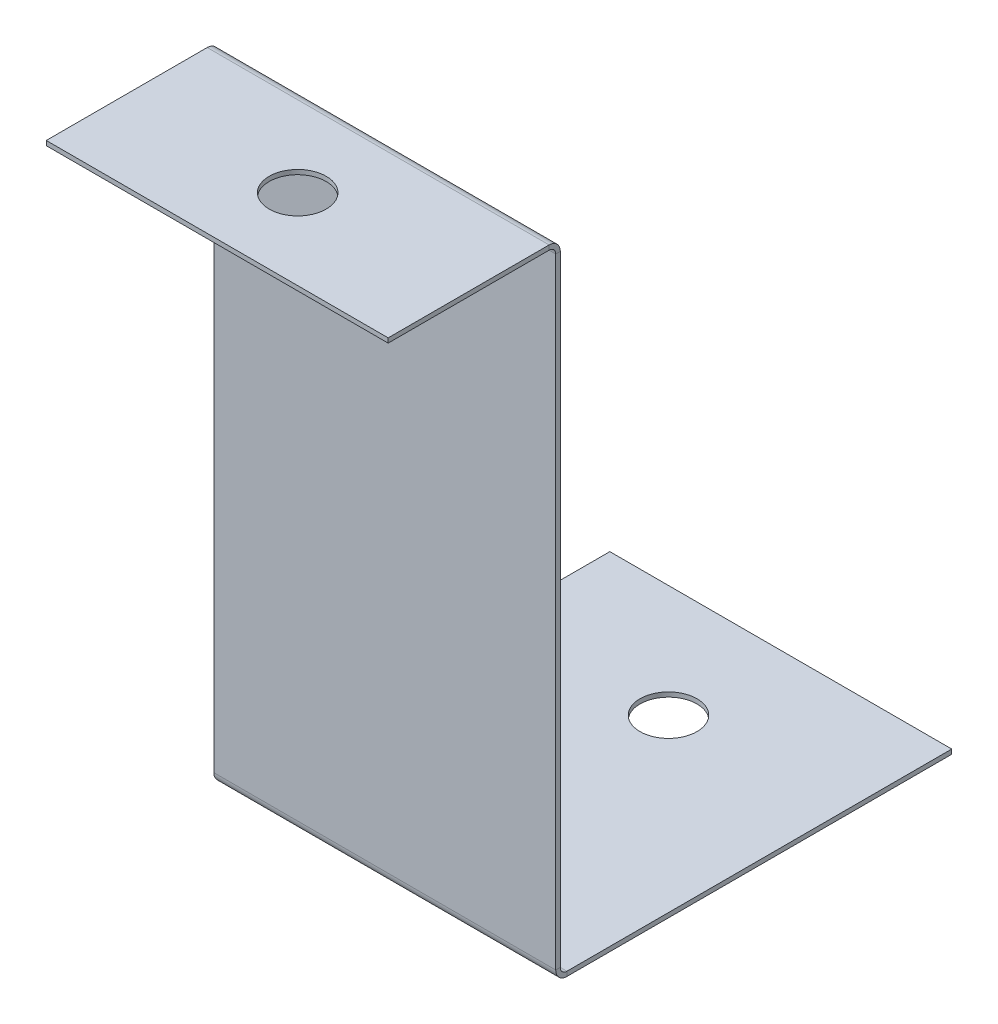
ISO-10303-21;
HEADER;
FILE_DESCRIPTION(('STEP AP214'),'2;1');
FILE_NAME('part.step','',(''),(''),'','','');
FILE_SCHEMA(('AUTOMOTIVE_DESIGN { 1 0 10303 214 1 1 1 1 }'));
ENDSEC;
DATA;
#1=APPLICATION_CONTEXT('core data for automotive mechanical design processes');
#2=APPLICATION_PROTOCOL_DEFINITION('international standard','automotive_design',2000,#1);
#3=PRODUCT_CONTEXT('',#1,'mechanical');
#4=PRODUCT('Part','Part','',(#3));
#5=PRODUCT_RELATED_PRODUCT_CATEGORY('part','',(#4));
#6=PRODUCT_DEFINITION_FORMATION('','',#4);
#7=PRODUCT_DEFINITION_CONTEXT('part definition',#1,'design');
#8=PRODUCT_DEFINITION('design','',#6,#7);
#9=PRODUCT_DEFINITION_SHAPE('','',#8);
#10=(LENGTH_UNIT() NAMED_UNIT(*) SI_UNIT(.MILLI.,.METRE.));
#11=(NAMED_UNIT(*) PLANE_ANGLE_UNIT() SI_UNIT($,.RADIAN.));
#12=(NAMED_UNIT(*) SI_UNIT($,.STERADIAN.) SOLID_ANGLE_UNIT());
#13=UNCERTAINTY_MEASURE_WITH_UNIT(LENGTH_MEASURE(1.E-05),#10,'distance_accuracy_value','');
#14=(GEOMETRIC_REPRESENTATION_CONTEXT(3) GLOBAL_UNCERTAINTY_ASSIGNED_CONTEXT((#13)) GLOBAL_UNIT_ASSIGNED_CONTEXT((#10,
#11,#12)) REPRESENTATION_CONTEXT('',''));
#15=CARTESIAN_POINT('',(0.,0.,0.));
#16=DIRECTION('',(0.,0.,1.));
#17=DIRECTION('',(1.,0.,0.));
#18=AXIS2_PLACEMENT_3D('',#15,#16,#17);
#19=CARTESIAN_POINT('',(-19.05,-5.58799999999952,132.930338317354));
#20=DIRECTION('',(0.,0.,1.));
#21=DIRECTION('',(0.,-1.,0.));
#22=AXIS2_PLACEMENT_3D('',#19,#20,#21);
#23=PLANE('',#22);
#24=DIRECTION('',(1.,0.,0.));
#25=VECTOR('',#24,1.);
#26=CARTESIAN_POINT('',(-19.05,-5.07999999999953,132.930338317354));
#27=LINE('',#26,#25);
#28=CARTESIAN_POINT('',(-19.05,-5.07999999999953,132.930338317354));
#29=VERTEX_POINT('',#28);
#30=CARTESIAN_POINT('',(19.05,-5.07999999999953,132.930338317354));
#31=VERTEX_POINT('',#30);
#32=EDGE_CURVE('E263',#29,#31,#27,.T.);
#33=ORIENTED_EDGE('',*,*,#32,.F.);
#34=DIRECTION('',(0.,1.,0.));
#35=VECTOR('',#34,1.);
#36=CARTESIAN_POINT('',(-19.05,-5.58799999999952,132.930338317354));
#37=LINE('',#36,#35);
#38=CARTESIAN_POINT('',(-19.05,-5.58799999999952,132.930338317354));
#39=VERTEX_POINT('',#38);
#40=EDGE_CURVE('E249',#39,#29,#37,.T.);
#41=ORIENTED_EDGE('',*,*,#40,.F.);
#42=DIRECTION('',(1.,0.,0.));
#43=VECTOR('',#42,1.);
#44=CARTESIAN_POINT('',(-19.05,-5.58799999999952,132.930338317354));
#45=LINE('',#44,#43);
#46=CARTESIAN_POINT('',(19.05,-5.58799999999952,132.930338317354));
#47=VERTEX_POINT('',#46);
#48=EDGE_CURVE('E284',#39,#47,#45,.T.);
#49=ORIENTED_EDGE('',*,*,#48,.T.);
#50=DIRECTION('',(0.,1.,0.));
#51=VECTOR('',#50,1.);
#52=CARTESIAN_POINT('',(19.05,-5.58799999999952,132.930338317354));
#53=LINE('',#52,#51);
#54=EDGE_CURVE('E281',#47,#31,#53,.T.);
#55=ORIENTED_EDGE('',*,*,#54,.T.);
#56=EDGE_LOOP('',(#33,#41,#49,#55));
#57=FACE_BOUND('',#56,.T.);
#58=ADVANCED_FACE('F77',(#57),#23,.T.);
#59=CARTESIAN_POINT('',(0.,5.58799999999961,123.962761448346));
#60=DIRECTION('',(0.,1.,0.));
#61=DIRECTION('',(0.,0.,1.));
#62=AXIS2_PLACEMENT_3D('',#59,#60,#61);
#63=CYLINDRICAL_SURFACE('',#62,3.17499999999999);
#64=CARTESIAN_POINT('',(0.,-5.58799999999955,123.962761448346));
#65=DIRECTION('',(0.,-1.,0.));
#66=DIRECTION('',(0.,0.,-1.));
#67=AXIS2_PLACEMENT_3D('',#64,#65,#66);
#68=CIRCLE('',#67,3.17499999999999);
#69=CARTESIAN_POINT('',(0.,-5.58799999999956,120.787761448346));
#70=VERTEX_POINT('',#69);
#71=EDGE_CURVE('E173',#70,#70,#68,.F.);
#72=ORIENTED_EDGE('',*,*,#71,.F.);
#73=EDGE_LOOP('',(#72));
#74=FACE_BOUND('',#73,.T.);
#75=CARTESIAN_POINT('',(0.,-5.07999999999956,123.962761448346));
#76=DIRECTION('',(0.,-1.,0.));
#77=DIRECTION('',(0.,0.,-1.));
#78=AXIS2_PLACEMENT_3D('',#75,#76,#77);
#79=CIRCLE('',#78,3.17499999999999);
#80=CARTESIAN_POINT('',(0.,-5.07999999999957,120.787761448346));
#81=VERTEX_POINT('',#80);
#82=EDGE_CURVE('E228',#81,#81,#79,.T.);
#83=ORIENTED_EDGE('',*,*,#82,.F.);
#84=EDGE_LOOP('',(#83));
#85=FACE_BOUND('',#84,.T.);
#86=ADVANCED_FACE('F407',(#74,#85),#63,.F.);
#87=CARTESIAN_POINT('',(0.,-5.5880000000005,-146.469661682647));
#88=DIRECTION('',(0.,-1.,0.));
#89=DIRECTION('',(-1.,0.,0.));
#90=AXIS2_PLACEMENT_3D('',#87,#88,#89);
#91=PLANE('',#90);
#92=DIRECTION('',(0.,0.,1.));
#93=VECTOR('',#92,1.);
#94=CARTESIAN_POINT('',(-19.05,-5.58799999999952,132.930338317354));
#95=LINE('',#94,#93);
#96=CARTESIAN_POINT('',(-19.05,-5.58799999999962,114.995184579338));
#97=VERTEX_POINT('',#96);
#98=EDGE_CURVE('E254',#97,#39,#95,.T.);
#99=ORIENTED_EDGE('',*,*,#98,.F.);
#100=DIRECTION('',(1.,0.,0.));
#101=VECTOR('',#100,1.);
#102=CARTESIAN_POINT('',(0.,-5.58799999999958,114.995184579338));
#103=LINE('',#102,#101);
#104=CARTESIAN_POINT('',(19.05,-5.58799999999959,114.995184579338));
#105=VERTEX_POINT('',#104);
#106=EDGE_CURVE('E278',#97,#105,#103,.T.);
#107=ORIENTED_EDGE('',*,*,#106,.T.);
#108=DIRECTION('',(0.,0.,-1.));
#109=VECTOR('',#108,1.);
#110=CARTESIAN_POINT('',(19.05,-5.58799999999952,132.930338317354));
#111=LINE('',#110,#109);
#112=EDGE_CURVE('E274',#47,#105,#111,.T.);
#113=ORIENTED_EDGE('',*,*,#112,.F.);
#114=ORIENTED_EDGE('',*,*,#48,.F.);
#115=EDGE_LOOP('',(#99,#107,#113,#114));
#116=FACE_BOUND('',#115,.T.);
#117=ORIENTED_EDGE('',*,*,#71,.T.);
#118=EDGE_LOOP('',(#117));
#119=FACE_BOUND('',#118,.T.);
#120=ADVANCED_FACE('F387',(#116,#119),#91,.T.);
#121=CARTESIAN_POINT('',(19.05,-5.58799999999952,132.930338317354));
#122=DIRECTION('',(1.,0.,0.));
#123=DIRECTION('',(0.,-1.,0.));
#124=AXIS2_PLACEMENT_3D('',#121,#122,#123);
#125=PLANE('',#124);
#126=ORIENTED_EDGE('',*,*,#112,.T.);
#127=DIRECTION('',(0.,1.,0.));
#128=VECTOR('',#127,1.);
#129=CARTESIAN_POINT('',(19.05,-5.58799999999947,114.995184579338));
#130=LINE('',#129,#128);
#131=CARTESIAN_POINT('',(19.05,-5.0799999999996,114.995184579338));
#132=VERTEX_POINT('',#131);
#133=EDGE_CURVE('E270',#105,#132,#130,.T.);
#134=ORIENTED_EDGE('',*,*,#133,.T.);
#135=DIRECTION('',(0.,0.,-1.));
#136=VECTOR('',#135,1.);
#137=CARTESIAN_POINT('',(19.05,-5.07999999999953,132.930338317354));
#138=LINE('',#137,#136);
#139=EDGE_CURVE('E260',#31,#132,#138,.T.);
#140=ORIENTED_EDGE('',*,*,#139,.F.);
#141=ORIENTED_EDGE('',*,*,#54,.F.);
#142=EDGE_LOOP('',(#126,#134,#140,#141));
#143=FACE_BOUND('',#142,.T.);
#144=ADVANCED_FACE('F391',(#143),#125,.T.);
#145=CARTESIAN_POINT('',(-19.05,-5.58799999999952,132.930338317354));
#146=DIRECTION('',(-1.,0.,0.));
#147=DIRECTION('',(0.,1.,0.));
#148=AXIS2_PLACEMENT_3D('',#145,#146,#147);
#149=PLANE('',#148);
#150=DIRECTION('',(0.,0.,1.));
#151=VECTOR('',#150,1.);
#152=CARTESIAN_POINT('',(-19.05,-5.07999999999953,132.930338317354));
#153=LINE('',#152,#151);
#154=CARTESIAN_POINT('',(-19.05,-5.0799999999996,114.995184579338));
#155=VERTEX_POINT('',#154);
#156=EDGE_CURVE('E267',#155,#29,#153,.T.);
#157=ORIENTED_EDGE('',*,*,#156,.F.);
#158=DIRECTION('',(0.,-1.,0.));
#159=VECTOR('',#158,1.);
#160=CARTESIAN_POINT('',(-19.05,-5.58799999999947,114.995184579338));
#161=LINE('',#160,#159);
#162=EDGE_CURVE('E257',#155,#97,#161,.T.);
#163=ORIENTED_EDGE('',*,*,#162,.T.);
#164=ORIENTED_EDGE('',*,*,#98,.T.);
#165=ORIENTED_EDGE('',*,*,#40,.T.);
#166=EDGE_LOOP('',(#157,#163,#164,#165));
#167=FACE_BOUND('',#166,.T.);
#168=ADVANCED_FACE('F402',(#167),#149,.T.);
#169=CARTESIAN_POINT('',(0.,-5.0800000000005,-146.469661682647));
#170=DIRECTION('',(0.,-1.,0.));
#171=DIRECTION('',(-1.,0.,0.));
#172=AXIS2_PLACEMENT_3D('',#169,#170,#171);
#173=PLANE('',#172);
#174=ORIENTED_EDGE('',*,*,#82,.T.);
#175=EDGE_LOOP('',(#174));
#176=FACE_BOUND('',#175,.T.);
#177=DIRECTION('',(1.,0.,0.));
#178=VECTOR('',#177,1.);
#179=CARTESIAN_POINT('',(0.,-5.07999999999958,114.995184579338));
#180=LINE('',#179,#178);
#181=EDGE_CURVE('E248',#155,#132,#180,.T.);
#182=ORIENTED_EDGE('',*,*,#181,.F.);
#183=ORIENTED_EDGE('',*,*,#156,.T.);
#184=ORIENTED_EDGE('',*,*,#32,.T.);
#185=ORIENTED_EDGE('',*,*,#139,.T.);
#186=EDGE_LOOP('',(#182,#183,#184,#185));
#187=FACE_BOUND('',#186,.T.);
#188=ADVANCED_FACE('F400',(#176,#187),#173,.F.);
#189=CARTESIAN_POINT('',(38.1351451548194,-6.32459999999962,114.995184579338));
#190=DIRECTION('',(-1.,0.,0.));
#191=DIRECTION('',(0.,-1.,0.));
#192=AXIS2_PLACEMENT_3D('',#189,#190,#191);
#193=CYLINDRICAL_SURFACE('',#192,0.7366);
#194=DIRECTION('',(1.,0.,0.));
#195=VECTOR('',#194,1.);
#196=CARTESIAN_POINT('',(0.,-6.32459999999963,114.258584579338));
#197=LINE('',#196,#195);
#198=CARTESIAN_POINT('',(-19.05,-6.32459999999961,114.258584579338));
#199=VERTEX_POINT('',#198);
#200=CARTESIAN_POINT('',(19.05,-6.32459999999961,114.258584579338));
#201=VERTEX_POINT('',#200);
#202=EDGE_CURVE('E200',#199,#201,#197,.T.);
#203=ORIENTED_EDGE('',*,*,#202,.T.);
#204=CARTESIAN_POINT('',(19.05,-6.32459999999962,114.995184579338));
#205=DIRECTION('',(1.,0.,0.));
#206=DIRECTION('',(0.,0.,1.));
#207=AXIS2_PLACEMENT_3D('',#204,#205,#206);
#208=CIRCLE('',#207,0.736600000000002);
#209=EDGE_CURVE('E295',#201,#105,#208,.T.);
#210=ORIENTED_EDGE('',*,*,#209,.T.);
#211=ORIENTED_EDGE('',*,*,#106,.F.);
#212=CARTESIAN_POINT('',(-19.05,-6.32459999999962,114.995184579338));
#213=DIRECTION('',(-1.,0.,0.));
#214=DIRECTION('',(0.,0.,-1.));
#215=AXIS2_PLACEMENT_3D('',#212,#213,#214);
#216=CIRCLE('',#215,0.736600000000002);
#217=EDGE_CURVE('E291',#97,#199,#216,.T.);
#218=ORIENTED_EDGE('',*,*,#217,.T.);
#219=EDGE_LOOP('',(#203,#210,#211,#218));
#220=FACE_BOUND('',#219,.T.);
#221=ADVANCED_FACE('F383',(#220),#193,.F.);
#222=CARTESIAN_POINT('',(19.05,-6.32459999999962,114.995184579338));
#223=DIRECTION('',(-1.,0.,0.));
#224=DIRECTION('',(0.,0.,1.));
#225=AXIS2_PLACEMENT_3D('',#222,#223,#224);
#226=PLANE('',#225);
#227=CARTESIAN_POINT('',(19.05,-6.32459999999962,114.995184579338));
#228=DIRECTION('',(-1.,0.,0.));
#229=DIRECTION('',(0.,-1.,0.));
#230=AXIS2_PLACEMENT_3D('',#227,#228,#229);
#231=CIRCLE('',#230,1.2446);
#232=CARTESIAN_POINT('',(19.05,-6.32459999999963,113.750584579338));
#233=VERTEX_POINT('',#232);
#234=EDGE_CURVE('E296',#233,#132,#231,.F.);
#235=ORIENTED_EDGE('',*,*,#234,.T.);
#236=ORIENTED_EDGE('',*,*,#133,.F.);
#237=ORIENTED_EDGE('',*,*,#209,.F.);
#238=DIRECTION('',(0.,0.,-1.));
#239=VECTOR('',#238,1.);
#240=CARTESIAN_POINT('',(19.05,-6.32459999999961,114.258584579338));
#241=LINE('',#240,#239);
#242=EDGE_CURVE('E204',#201,#233,#241,.T.);
#243=ORIENTED_EDGE('',*,*,#242,.T.);
#244=EDGE_LOOP('',(#235,#236,#237,#243));
#245=FACE_BOUND('',#244,.T.);
#246=ADVANCED_FACE('F394',(#245),#226,.F.);
#247=CARTESIAN_POINT('',(-19.05,-6.32459999999962,114.995184579338));
#248=DIRECTION('',(1.,0.,0.));
#249=DIRECTION('',(0.,0.,-1.));
#250=AXIS2_PLACEMENT_3D('',#247,#248,#249);
#251=PLANE('',#250);
#252=ORIENTED_EDGE('',*,*,#162,.F.);
#253=CARTESIAN_POINT('',(-19.05,-6.32459999999962,114.995184579338));
#254=DIRECTION('',(-1.,0.,0.));
#255=DIRECTION('',(0.,-1.,0.));
#256=AXIS2_PLACEMENT_3D('',#253,#254,#255);
#257=CIRCLE('',#256,1.2446);
#258=CARTESIAN_POINT('',(-19.05,-6.32459999999961,113.750584579338));
#259=VERTEX_POINT('',#258);
#260=EDGE_CURVE('E253',#155,#259,#257,.T.);
#261=ORIENTED_EDGE('',*,*,#260,.T.);
#262=DIRECTION('',(0.,0.,1.));
#263=VECTOR('',#262,1.);
#264=CARTESIAN_POINT('',(-19.05,-6.32459999999961,114.258584579338));
#265=LINE('',#264,#263);
#266=EDGE_CURVE('E86',#259,#199,#265,.T.);
#267=ORIENTED_EDGE('',*,*,#266,.T.);
#268=ORIENTED_EDGE('',*,*,#217,.F.);
#269=EDGE_LOOP('',(#252,#261,#267,#268));
#270=FACE_BOUND('',#269,.T.);
#271=ADVANCED_FACE('F379',(#270),#251,.F.);
#272=CARTESIAN_POINT('',(38.1351451548194,-6.32459999999962,114.995184579338));
#273=DIRECTION('',(-1.,0.,0.));
#274=DIRECTION('',(0.,-1.,0.));
#275=AXIS2_PLACEMENT_3D('',#272,#273,#274);
#276=CYLINDRICAL_SURFACE('',#275,1.2446);
#277=DIRECTION('',(1.,0.,0.));
#278=VECTOR('',#277,1.);
#279=CARTESIAN_POINT('',(0.,-6.32459999999963,113.750584579338));
#280=LINE('',#279,#278);
#281=EDGE_CURVE('E209',#259,#233,#280,.T.);
#282=ORIENTED_EDGE('',*,*,#281,.F.);
#283=ORIENTED_EDGE('',*,*,#260,.F.);
#284=ORIENTED_EDGE('',*,*,#181,.T.);
#285=ORIENTED_EDGE('',*,*,#234,.F.);
#286=EDGE_LOOP('',(#282,#283,#284,#285));
#287=FACE_BOUND('',#286,.T.);
#288=ADVANCED_FACE('F397',(#287),#276,.T.);
#289=CARTESIAN_POINT('',(0.,-266.233415420661,114.25858457934));
#290=DIRECTION('',(0.,0.,1.));
#291=DIRECTION('',(-1.,0.,0.));
#292=AXIS2_PLACEMENT_3D('',#289,#290,#291);
#293=PLANE('',#292);
#294=ORIENTED_EDGE('',*,*,#202,.F.);
#295=DIRECTION('',(0.,1.,0.));
#296=VECTOR('',#295,1.);
#297=CARTESIAN_POINT('',(-19.05,13.1665845793389,114.258584579338));
#298=LINE('',#297,#296);
#299=CARTESIAN_POINT('',(-19.05,-75.4219845793381,114.258584579339));
#300=VERTEX_POINT('',#299);
#301=EDGE_CURVE('E215',#300,#199,#298,.T.);
#302=ORIENTED_EDGE('',*,*,#301,.F.);
#303=DIRECTION('',(-1.,0.,0.));
#304=VECTOR('',#303,1.);
#305=CARTESIAN_POINT('',(0.,-75.4219845793381,114.258584579338));
#306=LINE('',#305,#304);
#307=CARTESIAN_POINT('',(19.05,-75.4219845793381,114.258584579338));
#308=VERTEX_POINT('',#307);
#309=EDGE_CURVE('E300',#308,#300,#306,.T.);
#310=ORIENTED_EDGE('',*,*,#309,.F.);
#311=DIRECTION('',(0.,-1.,0.));
#312=VECTOR('',#311,1.);
#313=CARTESIAN_POINT('',(19.05,13.1665845793389,114.258584579338));
#314=LINE('',#313,#312);
#315=EDGE_CURVE('E223',#201,#308,#314,.T.);
#316=ORIENTED_EDGE('',*,*,#315,.F.);
#317=EDGE_LOOP('',(#294,#302,#310,#316));
#318=FACE_BOUND('',#317,.T.);
#319=ADVANCED_FACE('F372',(#318),#293,.T.);
#320=CARTESIAN_POINT('',(19.05,13.1665845793389,114.258584579338));
#321=DIRECTION('',(1.,0.,0.));
#322=DIRECTION('',(0.,0.,1.));
#323=AXIS2_PLACEMENT_3D('',#320,#321,#322);
#324=PLANE('',#323);
#325=ORIENTED_EDGE('',*,*,#242,.F.);
#326=ORIENTED_EDGE('',*,*,#315,.T.);
#327=DIRECTION('',(0.,0.,1.));
#328=VECTOR('',#327,1.);
#329=CARTESIAN_POINT('',(19.05,-75.4219845793381,114.258584579338));
#330=LINE('',#329,#328);
#331=CARTESIAN_POINT('',(19.05,-75.4219845793381,113.750584579338));
#332=VERTEX_POINT('',#331);
#333=EDGE_CURVE('E227',#332,#308,#330,.T.);
#334=ORIENTED_EDGE('',*,*,#333,.F.);
#335=DIRECTION('',(0.,-1.,0.));
#336=VECTOR('',#335,1.);
#337=CARTESIAN_POINT('',(19.05,13.1665845793389,113.750584579338));
#338=LINE('',#337,#336);
#339=EDGE_CURVE('E219',#233,#332,#338,.T.);
#340=ORIENTED_EDGE('',*,*,#339,.F.);
#341=EDGE_LOOP('',(#325,#326,#334,#340));
#342=FACE_BOUND('',#341,.T.);
#343=ADVANCED_FACE('F452',(#342),#324,.T.);
#344=CARTESIAN_POINT('',(-19.05,13.1665845793389,114.258584579338));
#345=DIRECTION('',(-1.,0.,0.));
#346=DIRECTION('',(0.,0.,-1.));
#347=AXIS2_PLACEMENT_3D('',#344,#345,#346);
#348=PLANE('',#347);
#349=ORIENTED_EDGE('',*,*,#266,.F.);
#350=DIRECTION('',(0.,1.,0.));
#351=VECTOR('',#350,1.);
#352=CARTESIAN_POINT('',(-19.05,13.1665845793389,113.750584579338));
#353=LINE('',#352,#351);
#354=CARTESIAN_POINT('',(-19.05,-75.4219845793381,113.750584579338));
#355=VERTEX_POINT('',#354);
#356=EDGE_CURVE('E100',#355,#259,#353,.T.);
#357=ORIENTED_EDGE('',*,*,#356,.F.);
#358=DIRECTION('',(0.,0.,-1.));
#359=VECTOR('',#358,1.);
#360=CARTESIAN_POINT('',(-19.05,-75.4219845793381,114.258584579338));
#361=LINE('',#360,#359);
#362=EDGE_CURVE('E312',#300,#355,#361,.T.);
#363=ORIENTED_EDGE('',*,*,#362,.F.);
#364=ORIENTED_EDGE('',*,*,#301,.T.);
#365=EDGE_LOOP('',(#349,#357,#363,#364));
#366=FACE_BOUND('',#365,.T.);
#367=ADVANCED_FACE('F79',(#366),#348,.T.);
#368=CARTESIAN_POINT('',(0.,-266.233415420661,113.75058457934));
#369=DIRECTION('',(0.,0.,1.));
#370=DIRECTION('',(-1.,0.,0.));
#371=AXIS2_PLACEMENT_3D('',#368,#369,#370);
#372=PLANE('',#371);
#373=ORIENTED_EDGE('',*,*,#356,.T.);
#374=ORIENTED_EDGE('',*,*,#281,.T.);
#375=ORIENTED_EDGE('',*,*,#339,.T.);
#376=DIRECTION('',(-1.,0.,0.));
#377=VECTOR('',#376,1.);
#378=CARTESIAN_POINT('',(0.,-75.4219845793381,113.750584579338));
#379=LINE('',#378,#377);
#380=EDGE_CURVE('E222',#332,#355,#379,.T.);
#381=ORIENTED_EDGE('',*,*,#380,.T.);
#382=EDGE_LOOP('',(#373,#374,#375,#381));
#383=FACE_BOUND('',#382,.T.);
#384=ADVANCED_FACE('F366',(#383),#372,.F.);
#385=CARTESIAN_POINT('',(38.1351451548194,-75.4219845793381,113.013984579339));
#386=DIRECTION('',(-1.,0.,0.));
#387=DIRECTION('',(0.,0.,1.));
#388=AXIS2_PLACEMENT_3D('',#385,#386,#387);
#389=CYLINDRICAL_SURFACE('',#388,1.2446);
#390=ORIENTED_EDGE('',*,*,#309,.T.);
#391=CARTESIAN_POINT('',(-19.05,-75.4219845793381,113.013984579339));
#392=DIRECTION('',(1.,0.,0.));
#393=DIRECTION('',(0.,0.,1.));
#394=AXIS2_PLACEMENT_3D('',#391,#392,#393);
#395=CIRCLE('',#394,1.2446);
#396=CARTESIAN_POINT('',(-19.05,-76.6665845793381,113.013984579339));
#397=VERTEX_POINT('',#396);
#398=EDGE_CURVE('E196',#300,#397,#395,.T.);
#399=ORIENTED_EDGE('',*,*,#398,.T.);
#400=DIRECTION('',(-1.,0.,0.));
#401=VECTOR('',#400,1.);
#402=CARTESIAN_POINT('',(0.,-76.6665845793381,113.013984579339));
#403=LINE('',#402,#401);
#404=CARTESIAN_POINT('',(19.05,-76.6665845793381,113.013984579339));
#405=VERTEX_POINT('',#404);
#406=EDGE_CURVE('E333',#405,#397,#403,.T.);
#407=ORIENTED_EDGE('',*,*,#406,.F.);
#408=CARTESIAN_POINT('',(19.05,-75.4219845793381,113.013984579339));
#409=DIRECTION('',(-1.,0.,0.));
#410=DIRECTION('',(0.,0.,-1.));
#411=AXIS2_PLACEMENT_3D('',#408,#409,#410);
#412=CIRCLE('',#411,1.2446);
#413=EDGE_CURVE('E319',#405,#308,#412,.T.);
#414=ORIENTED_EDGE('',*,*,#413,.T.);
#415=EDGE_LOOP('',(#390,#399,#407,#414));
#416=FACE_BOUND('',#415,.T.);
#417=ADVANCED_FACE('F355',(#416),#389,.T.);
#418=CARTESIAN_POINT('',(19.05,-75.4219845793381,113.013984579339));
#419=DIRECTION('',(1.,0.,0.));
#420=DIRECTION('',(0.,0.,-1.));
#421=AXIS2_PLACEMENT_3D('',#418,#419,#420);
#422=PLANE('',#421);
#423=DIRECTION('',(0.,-1.,0.));
#424=VECTOR('',#423,1.);
#425=CARTESIAN_POINT('',(19.05,-76.6665845793381,113.013984579338));
#426=LINE('',#425,#424);
#427=CARTESIAN_POINT('',(19.05,-76.1585845793381,113.013984579339));
#428=VERTEX_POINT('',#427);
#429=EDGE_CURVE('E337',#428,#405,#426,.T.);
#430=ORIENTED_EDGE('',*,*,#429,.F.);
#431=CARTESIAN_POINT('',(19.05,-75.4219845793381,113.013984579339));
#432=DIRECTION('',(-1.,0.,0.));
#433=DIRECTION('',(0.,0.,1.));
#434=AXIS2_PLACEMENT_3D('',#431,#432,#433);
#435=CIRCLE('',#434,0.7366);
#436=EDGE_CURVE('E218',#428,#332,#435,.T.);
#437=ORIENTED_EDGE('',*,*,#436,.T.);
#438=ORIENTED_EDGE('',*,*,#333,.T.);
#439=ORIENTED_EDGE('',*,*,#413,.F.);
#440=EDGE_LOOP('',(#430,#437,#438,#439));
#441=FACE_BOUND('',#440,.T.);
#442=ADVANCED_FACE('F362',(#441),#422,.T.);
#443=CARTESIAN_POINT('',(-19.05,-75.4219845793381,113.013984579339));
#444=DIRECTION('',(-1.,0.,0.));
#445=DIRECTION('',(0.,0.,1.));
#446=AXIS2_PLACEMENT_3D('',#443,#444,#445);
#447=PLANE('',#446);
#448=CARTESIAN_POINT('',(-19.05,-75.4219845793381,113.013984579339));
#449=DIRECTION('',(-1.,0.,0.));
#450=DIRECTION('',(0.,0.,1.));
#451=AXIS2_PLACEMENT_3D('',#448,#449,#450);
#452=CIRCLE('',#451,0.7366);
#453=CARTESIAN_POINT('',(-19.05,-76.1585845793381,113.013984579339));
#454=VERTEX_POINT('',#453);
#455=EDGE_CURVE('E323',#355,#454,#452,.F.);
#456=ORIENTED_EDGE('',*,*,#455,.T.);
#457=DIRECTION('',(0.,1.,0.));
#458=VECTOR('',#457,1.);
#459=CARTESIAN_POINT('',(-19.05,-76.6665845793381,113.013984579338));
#460=LINE('',#459,#458);
#461=EDGE_CURVE('E205',#397,#454,#460,.T.);
#462=ORIENTED_EDGE('',*,*,#461,.F.);
#463=ORIENTED_EDGE('',*,*,#398,.F.);
#464=ORIENTED_EDGE('',*,*,#362,.T.);
#465=EDGE_LOOP('',(#456,#462,#463,#464));
#466=FACE_BOUND('',#465,.T.);
#467=ADVANCED_FACE('F352',(#466),#447,.T.);
#468=CARTESIAN_POINT('',(38.1351451548194,-75.4219845793381,113.013984579339));
#469=DIRECTION('',(-1.,0.,0.));
#470=DIRECTION('',(0.,0.,1.));
#471=AXIS2_PLACEMENT_3D('',#468,#469,#470);
#472=CYLINDRICAL_SURFACE('',#471,0.7366);
#473=ORIENTED_EDGE('',*,*,#380,.F.);
#474=ORIENTED_EDGE('',*,*,#436,.F.);
#475=DIRECTION('',(-1.,0.,0.));
#476=VECTOR('',#475,1.);
#477=CARTESIAN_POINT('',(0.,-76.1585845793381,113.013984579339));
#478=LINE('',#477,#476);
#479=EDGE_CURVE('E188',#428,#454,#478,.T.);
#480=ORIENTED_EDGE('',*,*,#479,.T.);
#481=ORIENTED_EDGE('',*,*,#455,.F.);
#482=EDGE_LOOP('',(#473,#474,#480,#481));
#483=FACE_BOUND('',#482,.T.);
#484=ADVANCED_FACE('F365',(#483),#472,.F.);
#485=CARTESIAN_POINT('',(0.,76.6665845793382,82.6435922896691));
#486=DIRECTION('',(0.,1.,0.));
#487=DIRECTION('',(0.,0.,1.));
#488=AXIS2_PLACEMENT_3D('',#485,#486,#487);
#489=CYLINDRICAL_SURFACE('',#488,3.17499999999997);
#490=CARTESIAN_POINT('',(0.,-76.6665845793388,82.6435922896686));
#491=DIRECTION('',(0.,1.,0.));
#492=DIRECTION('',(0.,0.,1.));
#493=AXIS2_PLACEMENT_3D('',#490,#491,#492);
#494=CIRCLE('',#493,3.17499999999996);
#495=CARTESIAN_POINT('',(0.,-76.6665845793388,85.8185922896685));
#496=VERTEX_POINT('',#495);
#497=EDGE_CURVE('E231',#496,#496,#494,.T.);
#498=ORIENTED_EDGE('',*,*,#497,.F.);
#499=EDGE_LOOP('',(#498));
#500=FACE_BOUND('',#499,.T.);
#501=CARTESIAN_POINT('',(0.,-76.1585845793382,82.6435922896686));
#502=DIRECTION('',(0.,-1.,0.));
#503=DIRECTION('',(0.,0.,-1.));
#504=AXIS2_PLACEMENT_3D('',#501,#502,#503);
#505=CIRCLE('',#504,3.17499999999997);
#506=CARTESIAN_POINT('',(0.,-76.1585845793382,79.4685922896686));
#507=VERTEX_POINT('',#506);
#508=EDGE_CURVE('E237',#507,#507,#505,.T.);
#509=ORIENTED_EDGE('',*,*,#508,.F.);
#510=EDGE_LOOP('',(#509));
#511=FACE_BOUND('',#510,.T.);
#512=ADVANCED_FACE('F416',(#500,#511),#489,.F.);
#513=CARTESIAN_POINT('',(0.,-76.1585845793388,-76.2414154206615));
#514=DIRECTION('',(0.,-1.,0.));
#515=DIRECTION('',(-1.,0.,0.));
#516=AXIS2_PLACEMENT_3D('',#513,#514,#515);
#517=PLANE('',#516);
#518=ORIENTED_EDGE('',*,*,#508,.T.);
#519=EDGE_LOOP('',(#518));
#520=FACE_BOUND('',#519,.T.);
#521=DIRECTION('',(0.,0.,-1.));
#522=VECTOR('',#521,1.);
#523=CARTESIAN_POINT('',(19.05,-76.1585845793378,203.158584579339));
#524=LINE('',#523,#522);
#525=CARTESIAN_POINT('',(19.05,-76.1585845793381,70.1312144310942));
#526=VERTEX_POINT('',#525);
#527=EDGE_CURVE('E180',#428,#526,#524,.T.);
#528=ORIENTED_EDGE('',*,*,#527,.T.);
#529=DIRECTION('',(-1.,0.,0.));
#530=VECTOR('',#529,1.);
#531=CARTESIAN_POINT('',(0.,-76.1585845793382,70.1312144310942));
#532=LINE('',#531,#530);
#533=CARTESIAN_POINT('',(-19.05,-76.1585845793381,70.1312144310942));
#534=VERTEX_POINT('',#533);
#535=EDGE_CURVE('E165',#526,#534,#532,.T.);
#536=ORIENTED_EDGE('',*,*,#535,.T.);
#537=DIRECTION('',(0.,0.,1.));
#538=VECTOR('',#537,1.);
#539=CARTESIAN_POINT('',(-19.05,-76.1585845793378,203.158584579339));
#540=LINE('',#539,#538);
#541=EDGE_CURVE('E190',#534,#454,#540,.T.);
#542=ORIENTED_EDGE('',*,*,#541,.T.);
#543=ORIENTED_EDGE('',*,*,#479,.F.);
#544=EDGE_LOOP('',(#528,#536,#542,#543));
#545=FACE_BOUND('',#544,.T.);
#546=ADVANCED_FACE('F186',(#520,#545),#517,.F.);
#547=CARTESIAN_POINT('',(-19.05,-76.6665845793378,203.158584579339));
#548=DIRECTION('',(-1.,0.,0.));
#549=DIRECTION('',(0.,1.,0.));
#550=AXIS2_PLACEMENT_3D('',#547,#548,#549);
#551=PLANE('',#550);
#552=DIRECTION('',(0.,-1.,0.));
#553=VECTOR('',#552,1.);
#554=CARTESIAN_POINT('',(-19.05,-82.7506676608394,70.1312144310942));
#555=LINE('',#554,#553);
#556=CARTESIAN_POINT('',(-19.05,-76.6665845793383,70.1312144310942));
#557=VERTEX_POINT('',#556);
#558=EDGE_CURVE('E168',#534,#557,#555,.T.);
#559=ORIENTED_EDGE('',*,*,#558,.T.);
#560=DIRECTION('',(0.,0.,1.));
#561=VECTOR('',#560,1.);
#562=CARTESIAN_POINT('',(-19.05,-76.6665845793378,203.158584579339));
#563=LINE('',#562,#561);
#564=EDGE_CURVE('E194',#557,#397,#563,.T.);
#565=ORIENTED_EDGE('',*,*,#564,.T.);
#566=ORIENTED_EDGE('',*,*,#461,.T.);
#567=ORIENTED_EDGE('',*,*,#541,.F.);
#568=EDGE_LOOP('',(#559,#565,#566,#567));
#569=FACE_BOUND('',#568,.T.);
#570=ADVANCED_FACE('F348',(#569),#551,.T.);
#571=CARTESIAN_POINT('',(19.05,-76.6665845793378,203.158584579339));
#572=DIRECTION('',(1.,0.,0.));
#573=DIRECTION('',(0.,-1.,0.));
#574=AXIS2_PLACEMENT_3D('',#571,#572,#573);
#575=PLANE('',#574);
#576=DIRECTION('',(0.,-1.,0.));
#577=VECTOR('',#576,1.);
#578=CARTESIAN_POINT('',(19.05,-82.7506676608394,70.1312144310942));
#579=LINE('',#578,#577);
#580=CARTESIAN_POINT('',(19.05,-76.6665845793382,70.1312144310942));
#581=VERTEX_POINT('',#580);
#582=EDGE_CURVE('E92',#526,#581,#579,.T.);
#583=ORIENTED_EDGE('',*,*,#582,.F.);
#584=ORIENTED_EDGE('',*,*,#527,.F.);
#585=ORIENTED_EDGE('',*,*,#429,.T.);
#586=DIRECTION('',(0.,0.,-1.));
#587=VECTOR('',#586,1.);
#588=CARTESIAN_POINT('',(19.05,-76.6665845793378,203.158584579339));
#589=LINE('',#588,#587);
#590=EDGE_CURVE('E183',#405,#581,#589,.T.);
#591=ORIENTED_EDGE('',*,*,#590,.T.);
#592=EDGE_LOOP('',(#583,#584,#585,#591));
#593=FACE_BOUND('',#592,.T.);
#594=ADVANCED_FACE('F178',(#593),#575,.T.);
#595=CARTESIAN_POINT('',(0.,-76.6665845793388,-76.2414154206615));
#596=DIRECTION('',(0.,-1.,0.));
#597=DIRECTION('',(-1.,0.,0.));
#598=AXIS2_PLACEMENT_3D('',#595,#596,#597);
#599=PLANE('',#598);
#600=DIRECTION('',(-1.,0.,0.));
#601=VECTOR('',#600,1.);
#602=CARTESIAN_POINT('',(0.,-76.6665845793382,70.1312144310942));
#603=LINE('',#602,#601);
#604=EDGE_CURVE('E14',#581,#557,#603,.T.);
#605=ORIENTED_EDGE('',*,*,#604,.F.);
#606=ORIENTED_EDGE('',*,*,#590,.F.);
#607=ORIENTED_EDGE('',*,*,#406,.T.);
#608=ORIENTED_EDGE('',*,*,#564,.F.);
#609=EDGE_LOOP('',(#605,#606,#607,#608));
#610=FACE_BOUND('',#609,.T.);
#611=ORIENTED_EDGE('',*,*,#497,.T.);
#612=EDGE_LOOP('',(#611));
#613=FACE_BOUND('',#612,.T.);
#614=ADVANCED_FACE('F358',(#610,#613),#599,.T.);
#615=CARTESIAN_POINT('',(-19.05,-82.7506676608394,70.1312144310942));
#616=DIRECTION('',(0.,0.,1.));
#617=DIRECTION('',(1.,0.,0.));
#618=AXIS2_PLACEMENT_3D('',#615,#616,#617);
#619=PLANE('',#618);
#620=ORIENTED_EDGE('',*,*,#582,.T.);
#621=ORIENTED_EDGE('',*,*,#604,.T.);
#622=ORIENTED_EDGE('',*,*,#558,.F.);
#623=ORIENTED_EDGE('',*,*,#535,.F.);
#624=EDGE_LOOP('',(#620,#621,#622,#623));
#625=FACE_BOUND('',#624,.T.);
#626=ADVANCED_FACE('F166',(#625),#619,.F.);
#627=CLOSED_SHELL('',(#58,#86,#120,#144,#168,#188,#221,#246,#271,#288,#319,#343,#367,#384,#417,
#442,#467,#484,#512,#546,#570,#594,#614,#626));
#628=MANIFOLD_SOLID_BREP('B2',#627);
#629=ADVANCED_BREP_SHAPE_REPRESENTATION('',(#18,#628),#14);
#630=SHAPE_DEFINITION_REPRESENTATION(#9,#629);
ENDSEC;
END-ISO-10303-21;
